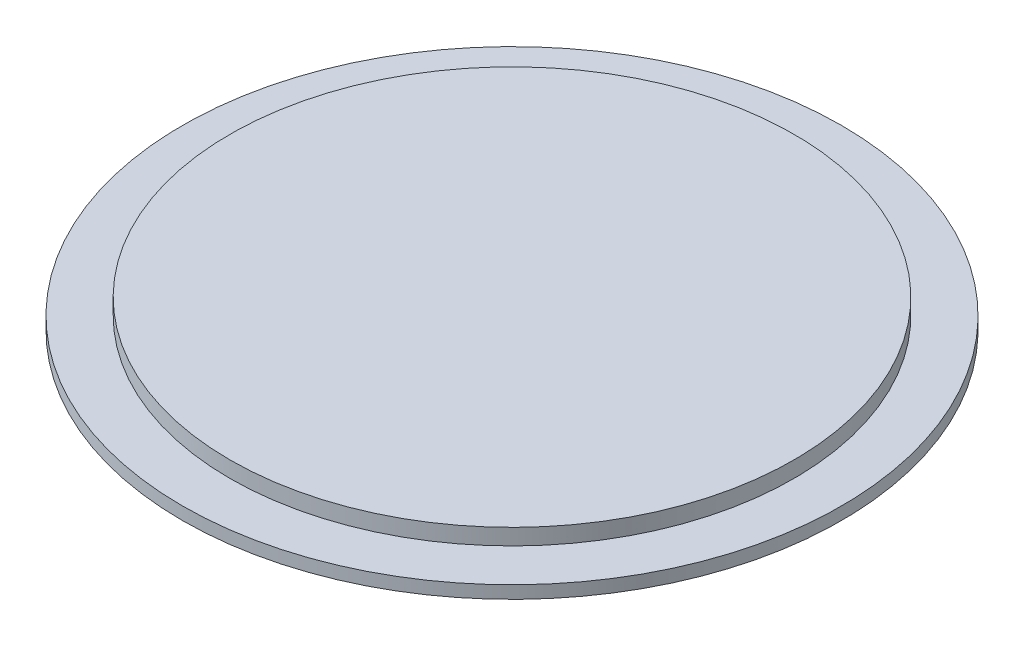
ISO-10303-21;
HEADER;
FILE_DESCRIPTION(('STEP AP214'),'2;1');
FILE_NAME('part.step','',(''),(''),'','','');
FILE_SCHEMA(('AUTOMOTIVE_DESIGN { 1 0 10303 214 1 1 1 1 }'));
ENDSEC;
DATA;
#1=APPLICATION_CONTEXT('core data for automotive mechanical design processes');
#2=APPLICATION_PROTOCOL_DEFINITION('international standard','automotive_design',2000,#1);
#3=PRODUCT_CONTEXT('',#1,'mechanical');
#4=PRODUCT('Part','Part','',(#3));
#5=PRODUCT_RELATED_PRODUCT_CATEGORY('part','',(#4));
#6=PRODUCT_DEFINITION_FORMATION('','',#4);
#7=PRODUCT_DEFINITION_CONTEXT('part definition',#1,'design');
#8=PRODUCT_DEFINITION('design','',#6,#7);
#9=PRODUCT_DEFINITION_SHAPE('','',#8);
#10=(LENGTH_UNIT() NAMED_UNIT(*) SI_UNIT(.MILLI.,.METRE.));
#11=(NAMED_UNIT(*) PLANE_ANGLE_UNIT() SI_UNIT($,.RADIAN.));
#12=(NAMED_UNIT(*) SI_UNIT($,.STERADIAN.) SOLID_ANGLE_UNIT());
#13=UNCERTAINTY_MEASURE_WITH_UNIT(LENGTH_MEASURE(1.E-05),#10,'distance_accuracy_value','');
#14=(GEOMETRIC_REPRESENTATION_CONTEXT(3) GLOBAL_UNCERTAINTY_ASSIGNED_CONTEXT((#13)) GLOBAL_UNIT_ASSIGNED_CONTEXT((#10,
#11,#12)) REPRESENTATION_CONTEXT('',''));
#15=CARTESIAN_POINT('',(0.,0.,0.));
#16=DIRECTION('',(0.,0.,1.));
#17=DIRECTION('',(1.,0.,0.));
#18=AXIS2_PLACEMENT_3D('',#15,#16,#17);
#19=CARTESIAN_POINT('',(0.,2.,0.));
#20=DIRECTION('',(0.,1.,0.));
#21=DIRECTION('',(0.,0.,1.));
#22=AXIS2_PLACEMENT_3D('',#19,#20,#21);
#23=PLANE('',#22);
#24=CARTESIAN_POINT('',(0.,2.,0.));
#25=DIRECTION('',(0.,1.,0.));
#26=DIRECTION('',(0.,0.,1.));
#27=AXIS2_PLACEMENT_3D('',#24,#25,#26);
#28=CIRCLE('',#27,52.);
#29=CARTESIAN_POINT('',(0.,2.,52.));
#30=VERTEX_POINT('',#29);
#31=EDGE_CURVE('E10',#30,#30,#28,.T.);
#32=ORIENTED_EDGE('',*,*,#31,.T.);
#33=EDGE_LOOP('',(#32));
#34=FACE_BOUND('',#33,.T.);
#35=CARTESIAN_POINT('',(0.,2.,0.));
#36=DIRECTION('',(0.,1.,0.));
#37=DIRECTION('',(0.,0.,1.));
#38=AXIS2_PLACEMENT_3D('',#35,#36,#37);
#39=CIRCLE('',#38,44.5);
#40=CARTESIAN_POINT('',(0.,2.,44.5));
#41=VERTEX_POINT('',#40);
#42=EDGE_CURVE('E44',#41,#41,#39,.T.);
#43=ORIENTED_EDGE('',*,*,#42,.F.);
#44=EDGE_LOOP('',(#43));
#45=FACE_BOUND('',#44,.T.);
#46=ADVANCED_FACE('F31',(#34,#45),#23,.T.);
#47=CARTESIAN_POINT('',(0.,2.,0.));
#48=DIRECTION('',(0.,-1.,0.));
#49=DIRECTION('',(0.,0.,-1.));
#50=AXIS2_PLACEMENT_3D('',#47,#48,#49);
#51=CYLINDRICAL_SURFACE('',#50,52.);
#52=ORIENTED_EDGE('',*,*,#31,.F.);
#53=EDGE_LOOP('',(#52));
#54=FACE_BOUND('',#53,.T.);
#55=CARTESIAN_POINT('',(0.,0.,0.));
#56=DIRECTION('',(0.,1.,0.));
#57=DIRECTION('',(0.,0.,1.));
#58=AXIS2_PLACEMENT_3D('',#55,#56,#57);
#59=CIRCLE('',#58,52.);
#60=CARTESIAN_POINT('',(0.,0.,52.));
#61=VERTEX_POINT('',#60);
#62=EDGE_CURVE('E35',#61,#61,#59,.T.);
#63=ORIENTED_EDGE('',*,*,#62,.T.);
#64=EDGE_LOOP('',(#63));
#65=FACE_BOUND('',#64,.T.);
#66=ADVANCED_FACE('F33',(#54,#65),#51,.T.);
#67=CARTESIAN_POINT('',(0.,0.,0.));
#68=DIRECTION('',(0.,1.,0.));
#69=DIRECTION('',(0.,0.,1.));
#70=AXIS2_PLACEMENT_3D('',#67,#68,#69);
#71=PLANE('',#70);
#72=ORIENTED_EDGE('',*,*,#62,.F.);
#73=EDGE_LOOP('',(#72));
#74=FACE_BOUND('',#73,.T.);
#75=ADVANCED_FACE('F55',(#74),#71,.F.);
#76=CARTESIAN_POINT('',(0.,4.54,0.));
#77=DIRECTION('',(0.,-1.,0.));
#78=DIRECTION('',(0.,0.,-1.));
#79=AXIS2_PLACEMENT_3D('',#76,#77,#78);
#80=CYLINDRICAL_SURFACE('',#79,44.5);
#81=CARTESIAN_POINT('',(0.,4.54,0.));
#82=DIRECTION('',(0.,1.,0.));
#83=DIRECTION('',(0.,0.,1.));
#84=AXIS2_PLACEMENT_3D('',#81,#82,#83);
#85=CIRCLE('',#84,44.5);
#86=CARTESIAN_POINT('',(0.,4.54,44.5));
#87=VERTEX_POINT('',#86);
#88=EDGE_CURVE('E42',#87,#87,#85,.T.);
#89=ORIENTED_EDGE('',*,*,#88,.F.);
#90=EDGE_LOOP('',(#89));
#91=FACE_BOUND('',#90,.T.);
#92=ORIENTED_EDGE('',*,*,#42,.T.);
#93=EDGE_LOOP('',(#92));
#94=FACE_BOUND('',#93,.T.);
#95=ADVANCED_FACE('F52',(#91,#94),#80,.T.);
#96=CARTESIAN_POINT('',(0.,4.54,0.));
#97=DIRECTION('',(0.,1.,0.));
#98=DIRECTION('',(0.,0.,1.));
#99=AXIS2_PLACEMENT_3D('',#96,#97,#98);
#100=PLANE('',#99);
#101=ORIENTED_EDGE('',*,*,#88,.T.);
#102=EDGE_LOOP('',(#101));
#103=FACE_BOUND('',#102,.T.);
#104=ADVANCED_FACE('F50',(#103),#100,.T.);
#105=CLOSED_SHELL('',(#46,#66,#75,#95,#104));
#106=MANIFOLD_SOLID_BREP('B2',#105);
#107=ADVANCED_BREP_SHAPE_REPRESENTATION('',(#18,#106),#14);
#108=SHAPE_DEFINITION_REPRESENTATION(#9,#107);
ENDSEC;
END-ISO-10303-21;
